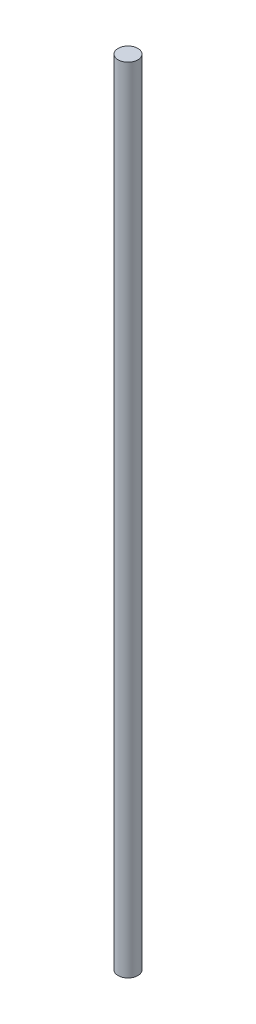
ISO-10303-21;
HEADER;
FILE_DESCRIPTION(('STEP AP214'),'2;1');
FILE_NAME('part.step','',(''),(''),'','','');
FILE_SCHEMA(('AUTOMOTIVE_DESIGN { 1 0 10303 214 1 1 1 1 }'));
ENDSEC;
DATA;
#1=APPLICATION_CONTEXT('core data for automotive mechanical design processes');
#2=APPLICATION_PROTOCOL_DEFINITION('international standard','automotive_design',2000,#1);
#3=PRODUCT_CONTEXT('',#1,'mechanical');
#4=PRODUCT('Part','Part','',(#3));
#5=PRODUCT_RELATED_PRODUCT_CATEGORY('part','',(#4));
#6=PRODUCT_DEFINITION_FORMATION('','',#4);
#7=PRODUCT_DEFINITION_CONTEXT('part definition',#1,'design');
#8=PRODUCT_DEFINITION('design','',#6,#7);
#9=PRODUCT_DEFINITION_SHAPE('','',#8);
#10=(LENGTH_UNIT() NAMED_UNIT(*) SI_UNIT(.MILLI.,.METRE.));
#11=(NAMED_UNIT(*) PLANE_ANGLE_UNIT() SI_UNIT($,.RADIAN.));
#12=(NAMED_UNIT(*) SI_UNIT($,.STERADIAN.) SOLID_ANGLE_UNIT());
#13=UNCERTAINTY_MEASURE_WITH_UNIT(LENGTH_MEASURE(1.E-05),#10,'distance_accuracy_value','');
#14=(GEOMETRIC_REPRESENTATION_CONTEXT(3) GLOBAL_UNCERTAINTY_ASSIGNED_CONTEXT((#13)) GLOBAL_UNIT_ASSIGNED_CONTEXT((#10,
#11,#12)) REPRESENTATION_CONTEXT('',''));
#15=CARTESIAN_POINT('',(0.,0.,0.));
#16=DIRECTION('',(0.,0.,1.));
#17=DIRECTION('',(1.,0.,0.));
#18=AXIS2_PLACEMENT_3D('',#15,#16,#17);
#19=CARTESIAN_POINT('',(0.,120.,0.));
#20=DIRECTION('',(0.,-1.,0.));
#21=DIRECTION('',(0.,0.,-1.));
#22=AXIS2_PLACEMENT_3D('',#19,#20,#21);
#23=CYLINDRICAL_SURFACE('',#22,1.5);
#24=CARTESIAN_POINT('',(0.,120.,0.));
#25=DIRECTION('',(0.,1.,0.));
#26=DIRECTION('',(0.,0.,1.));
#27=AXIS2_PLACEMENT_3D('',#24,#25,#26);
#28=CIRCLE('',#27,1.5);
#29=CARTESIAN_POINT('',(0.,120.,1.5));
#30=VERTEX_POINT('',#29);
#31=EDGE_CURVE('E10',#30,#30,#28,.T.);
#32=ORIENTED_EDGE('',*,*,#31,.F.);
#33=EDGE_LOOP('',(#32));
#34=FACE_BOUND('',#33,.T.);
#35=CARTESIAN_POINT('',(0.,0.,0.));
#36=DIRECTION('',(0.,1.,0.));
#37=DIRECTION('',(0.,0.,1.));
#38=AXIS2_PLACEMENT_3D('',#35,#36,#37);
#39=CIRCLE('',#38,1.5);
#40=CARTESIAN_POINT('',(0.,0.,1.5));
#41=VERTEX_POINT('',#40);
#42=EDGE_CURVE('E31',#41,#41,#39,.T.);
#43=ORIENTED_EDGE('',*,*,#42,.T.);
#44=EDGE_LOOP('',(#43));
#45=FACE_BOUND('',#44,.T.);
#46=ADVANCED_FACE('F28',(#34,#45),#23,.T.);
#47=CARTESIAN_POINT('',(0.,120.,0.));
#48=DIRECTION('',(0.,1.,0.));
#49=DIRECTION('',(0.,0.,1.));
#50=AXIS2_PLACEMENT_3D('',#47,#48,#49);
#51=PLANE('',#50);
#52=ORIENTED_EDGE('',*,*,#31,.T.);
#53=EDGE_LOOP('',(#52));
#54=FACE_BOUND('',#53,.T.);
#55=ADVANCED_FACE('F43',(#54),#51,.T.);
#56=CARTESIAN_POINT('',(0.,0.,0.));
#57=DIRECTION('',(0.,1.,0.));
#58=DIRECTION('',(0.,0.,1.));
#59=AXIS2_PLACEMENT_3D('',#56,#57,#58);
#60=PLANE('',#59);
#61=ORIENTED_EDGE('',*,*,#42,.F.);
#62=EDGE_LOOP('',(#61));
#63=FACE_BOUND('',#62,.T.);
#64=ADVANCED_FACE('F41',(#63),#60,.F.);
#65=CLOSED_SHELL('',(#46,#55,#64));
#66=MANIFOLD_SOLID_BREP('B2',#65);
#67=ADVANCED_BREP_SHAPE_REPRESENTATION('',(#18,#66),#14);
#68=SHAPE_DEFINITION_REPRESENTATION(#9,#67);
ENDSEC;
END-ISO-10303-21;
